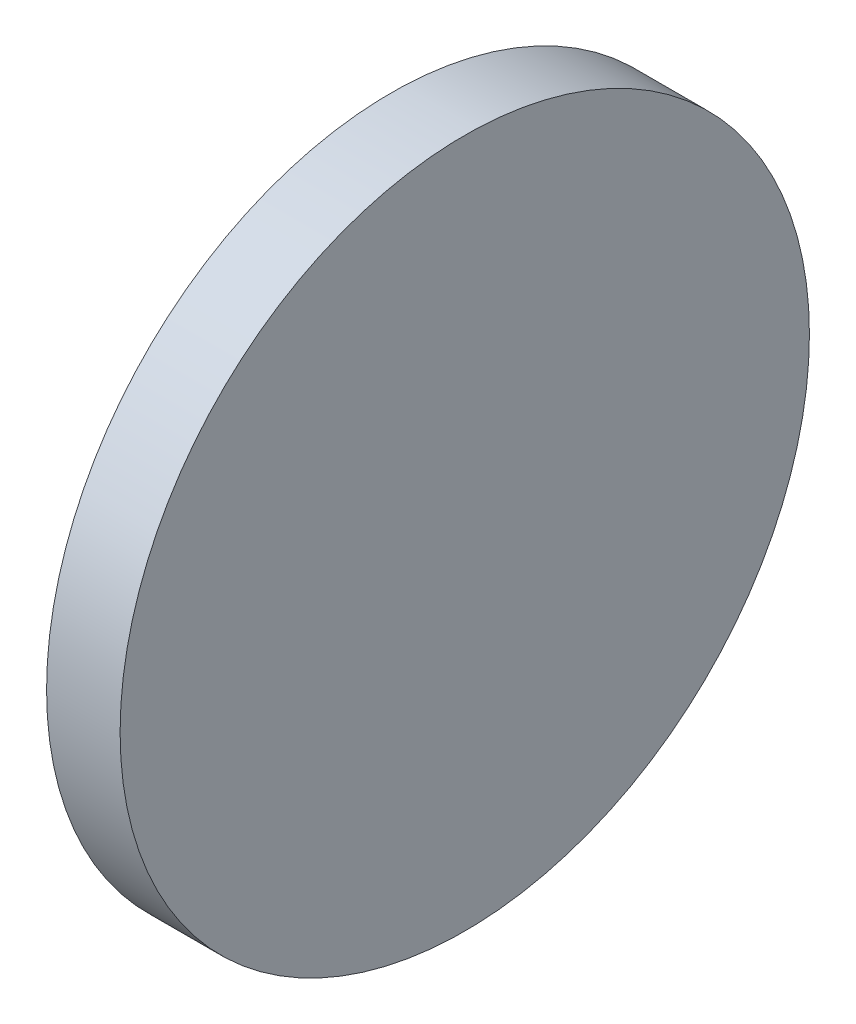
ISO-10303-21;
HEADER;
FILE_DESCRIPTION(('STEP AP214'),'2;1');
FILE_NAME('part.step','',(''),(''),'','','');
FILE_SCHEMA(('AUTOMOTIVE_DESIGN { 1 0 10303 214 1 1 1 1 }'));
ENDSEC;
DATA;
#1=APPLICATION_CONTEXT('core data for automotive mechanical design processes');
#2=APPLICATION_PROTOCOL_DEFINITION('international standard','automotive_design',2000,#1);
#3=PRODUCT_CONTEXT('',#1,'mechanical');
#4=PRODUCT('Part','Part','',(#3));
#5=PRODUCT_RELATED_PRODUCT_CATEGORY('part','',(#4));
#6=PRODUCT_DEFINITION_FORMATION('','',#4);
#7=PRODUCT_DEFINITION_CONTEXT('part definition',#1,'design');
#8=PRODUCT_DEFINITION('design','',#6,#7);
#9=PRODUCT_DEFINITION_SHAPE('','',#8);
#10=(LENGTH_UNIT() NAMED_UNIT(*) SI_UNIT(.MILLI.,.METRE.));
#11=(NAMED_UNIT(*) PLANE_ANGLE_UNIT() SI_UNIT($,.RADIAN.));
#12=(NAMED_UNIT(*) SI_UNIT($,.STERADIAN.) SOLID_ANGLE_UNIT());
#13=UNCERTAINTY_MEASURE_WITH_UNIT(LENGTH_MEASURE(1.E-05),#10,'distance_accuracy_value','');
#14=(GEOMETRIC_REPRESENTATION_CONTEXT(3) GLOBAL_UNCERTAINTY_ASSIGNED_CONTEXT((#13)) GLOBAL_UNIT_ASSIGNED_CONTEXT((#10,
#11,#12)) REPRESENTATION_CONTEXT('',''));
#15=CARTESIAN_POINT('',(0.,0.,0.));
#16=DIRECTION('',(0.,0.,1.));
#17=DIRECTION('',(1.,0.,0.));
#18=AXIS2_PLACEMENT_3D('',#15,#16,#17);
#19=CARTESIAN_POINT('',(-70.2,30.,0.));
#20=DIRECTION('',(-1.,0.,0.));
#21=DIRECTION('',(0.,0.,1.));
#22=AXIS2_PLACEMENT_3D('',#19,#20,#21);
#23=CYLINDRICAL_SURFACE('',#22,7.5);
#24=CARTESIAN_POINT('',(-70.2,30.,0.));
#25=DIRECTION('',(1.,0.,0.));
#26=DIRECTION('',(0.,0.,-1.));
#27=AXIS2_PLACEMENT_3D('',#24,#25,#26);
#28=CIRCLE('',#27,7.5);
#29=CARTESIAN_POINT('',(-70.2,30.,-7.5));
#30=VERTEX_POINT('',#29);
#31=EDGE_CURVE('E10',#30,#30,#28,.T.);
#32=ORIENTED_EDGE('',*,*,#31,.F.);
#33=EDGE_LOOP('',(#32));
#34=FACE_BOUND('',#33,.T.);
#35=CARTESIAN_POINT('',(-71.8,30.,0.));
#36=DIRECTION('',(1.,0.,0.));
#37=DIRECTION('',(0.,0.,-1.));
#38=AXIS2_PLACEMENT_3D('',#35,#36,#37);
#39=CIRCLE('',#38,7.5);
#40=CARTESIAN_POINT('',(-71.8,30.,-7.5));
#41=VERTEX_POINT('',#40);
#42=EDGE_CURVE('E37',#41,#41,#39,.T.);
#43=ORIENTED_EDGE('',*,*,#42,.T.);
#44=EDGE_LOOP('',(#43));
#45=FACE_BOUND('',#44,.T.);
#46=ADVANCED_FACE('F40',(#34,#45),#23,.T.);
#47=CARTESIAN_POINT('',(-70.2,30.,0.));
#48=DIRECTION('',(1.,0.,0.));
#49=DIRECTION('',(0.,0.,-1.));
#50=AXIS2_PLACEMENT_3D('',#47,#48,#49);
#51=PLANE('',#50);
#52=ORIENTED_EDGE('',*,*,#31,.T.);
#53=EDGE_LOOP('',(#52));
#54=FACE_BOUND('',#53,.T.);
#55=ADVANCED_FACE('F55',(#54),#51,.T.);
#56=CARTESIAN_POINT('',(-71.8,30.,0.));
#57=DIRECTION('',(1.,0.,0.));
#58=DIRECTION('',(0.,0.,-1.));
#59=AXIS2_PLACEMENT_3D('',#56,#57,#58);
#60=PLANE('',#59);
#61=ORIENTED_EDGE('',*,*,#42,.F.);
#62=EDGE_LOOP('',(#61));
#63=FACE_BOUND('',#62,.T.);
#64=ADVANCED_FACE('F49',(#63),#60,.F.);
#65=CLOSED_SHELL('',(#46,#55,#64));
#66=MANIFOLD_SOLID_BREP('B2',#65);
#67=ADVANCED_BREP_SHAPE_REPRESENTATION('',(#18,#66),#14);
#68=SHAPE_DEFINITION_REPRESENTATION(#9,#67);
ENDSEC;
END-ISO-10303-21;
